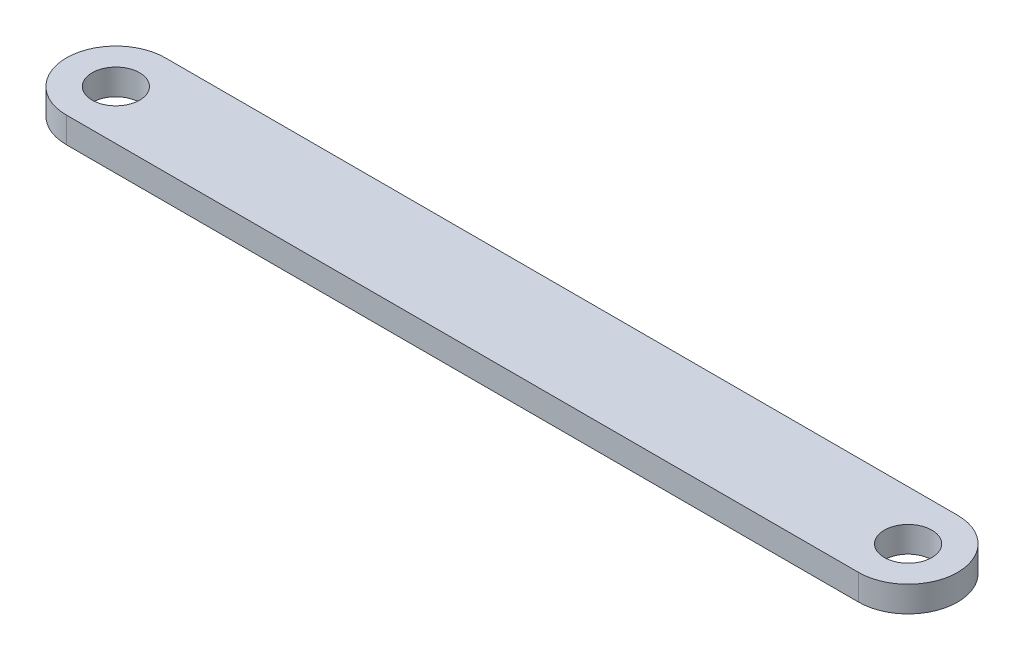
ISO-10303-21;
HEADER;
FILE_DESCRIPTION(('STEP AP214'),'2;1');
FILE_NAME('part.step','',(''),(''),'','','');
FILE_SCHEMA(('AUTOMOTIVE_DESIGN { 1 0 10303 214 1 1 1 1 }'));
ENDSEC;
DATA;
#1=APPLICATION_CONTEXT('core data for automotive mechanical design processes');
#2=APPLICATION_PROTOCOL_DEFINITION('international standard','automotive_design',2000,#1);
#3=PRODUCT_CONTEXT('',#1,'mechanical');
#4=PRODUCT('Part','Part','',(#3));
#5=PRODUCT_RELATED_PRODUCT_CATEGORY('part','',(#4));
#6=PRODUCT_DEFINITION_FORMATION('','',#4);
#7=PRODUCT_DEFINITION_CONTEXT('part definition',#1,'design');
#8=PRODUCT_DEFINITION('design','',#6,#7);
#9=PRODUCT_DEFINITION_SHAPE('','',#8);
#10=(LENGTH_UNIT() NAMED_UNIT(*) SI_UNIT(.MILLI.,.METRE.));
#11=(NAMED_UNIT(*) PLANE_ANGLE_UNIT() SI_UNIT($,.RADIAN.));
#12=(NAMED_UNIT(*) SI_UNIT($,.STERADIAN.) SOLID_ANGLE_UNIT());
#13=UNCERTAINTY_MEASURE_WITH_UNIT(LENGTH_MEASURE(1.E-05),#10,'distance_accuracy_value','');
#14=(GEOMETRIC_REPRESENTATION_CONTEXT(3) GLOBAL_UNCERTAINTY_ASSIGNED_CONTEXT((#13)) GLOBAL_UNIT_ASSIGNED_CONTEXT((#10,
#11,#12)) REPRESENTATION_CONTEXT('',''));
#15=CARTESIAN_POINT('',(0.,0.,0.));
#16=DIRECTION('',(0.,0.,1.));
#17=DIRECTION('',(1.,0.,0.));
#18=AXIS2_PLACEMENT_3D('',#15,#16,#17);
#19=CARTESIAN_POINT('',(0.,6.5,0.));
#20=DIRECTION('',(0.,1.,0.));
#21=DIRECTION('',(0.,0.,1.));
#22=AXIS2_PLACEMENT_3D('',#19,#20,#21);
#23=PLANE('',#22);
#24=CARTESIAN_POINT('',(0.,6.5,0.));
#25=DIRECTION('',(0.,1.,0.));
#26=DIRECTION('',(0.,0.,1.));
#27=AXIS2_PLACEMENT_3D('',#24,#25,#26);
#28=CIRCLE('',#27,6.);
#29=CARTESIAN_POINT('',(0.,6.5,-6.));
#30=VERTEX_POINT('',#29);
#31=EDGE_CURVE('E112',#30,#30,#28,.T.);
#32=ORIENTED_EDGE('',*,*,#31,.F.);
#33=EDGE_LOOP('',(#32));
#34=FACE_BOUND('',#33,.T.);
#35=CARTESIAN_POINT('',(0.,6.5,0.));
#36=DIRECTION('',(0.,1.,0.));
#37=DIRECTION('',(0.,0.,1.));
#38=AXIS2_PLACEMENT_3D('',#35,#36,#37);
#39=CIRCLE('',#38,12.5);
#40=CARTESIAN_POINT('',(0.,6.5,-12.5));
#41=VERTEX_POINT('',#40);
#42=CARTESIAN_POINT('',(0.,6.5,12.5));
#43=VERTEX_POINT('',#42);
#44=EDGE_CURVE('E92',#41,#43,#39,.T.);
#45=ORIENTED_EDGE('',*,*,#44,.T.);
#46=DIRECTION('',(1.,0.,0.));
#47=VECTOR('',#46,1.);
#48=CARTESIAN_POINT('',(0.,6.5,12.5));
#49=LINE('',#48,#47);
#50=CARTESIAN_POINT('',(200.,6.5,12.5));
#51=VERTEX_POINT('',#50);
#52=EDGE_CURVE('E87',#43,#51,#49,.T.);
#53=ORIENTED_EDGE('',*,*,#52,.T.);
#54=CARTESIAN_POINT('',(200.,6.5,0.));
#55=DIRECTION('',(0.,1.,0.));
#56=DIRECTION('',(0.,0.,1.));
#57=AXIS2_PLACEMENT_3D('',#54,#55,#56);
#58=CIRCLE('',#57,12.5);
#59=CARTESIAN_POINT('',(200.,6.5,-12.5));
#60=VERTEX_POINT('',#59);
#61=EDGE_CURVE('E90',#51,#60,#58,.T.);
#62=ORIENTED_EDGE('',*,*,#61,.T.);
#63=DIRECTION('',(-1.,0.,0.));
#64=VECTOR('',#63,1.);
#65=CARTESIAN_POINT('',(0.,6.5,-12.5));
#66=LINE('',#65,#64);
#67=EDGE_CURVE('E57',#60,#41,#66,.T.);
#68=ORIENTED_EDGE('',*,*,#67,.T.);
#69=EDGE_LOOP('',(#45,#53,#62,#68));
#70=FACE_BOUND('',#69,.T.);
#71=CARTESIAN_POINT('',(200.,6.5,0.));
#72=DIRECTION('',(0.,1.,0.));
#73=DIRECTION('',(0.,0.,1.));
#74=AXIS2_PLACEMENT_3D('',#71,#72,#73);
#75=CIRCLE('',#74,6.00000000000002);
#76=CARTESIAN_POINT('',(200.,6.5,-6.00000000000002));
#77=VERTEX_POINT('',#76);
#78=EDGE_CURVE('E134',#77,#77,#75,.T.);
#79=ORIENTED_EDGE('',*,*,#78,.F.);
#80=EDGE_LOOP('',(#79));
#81=FACE_BOUND('',#80,.T.);
#82=ADVANCED_FACE('F39',(#34,#70,#81),#23,.T.);
#83=CARTESIAN_POINT('',(0.,0.,0.));
#84=DIRECTION('',(0.,1.,0.));
#85=DIRECTION('',(0.,0.,1.));
#86=AXIS2_PLACEMENT_3D('',#83,#84,#85);
#87=PLANE('',#86);
#88=CARTESIAN_POINT('',(0.,0.,0.));
#89=DIRECTION('',(0.,1.,0.));
#90=DIRECTION('',(0.,0.,1.));
#91=AXIS2_PLACEMENT_3D('',#88,#89,#90);
#92=CIRCLE('',#91,12.5);
#93=CARTESIAN_POINT('',(0.,0.,-12.5));
#94=VERTEX_POINT('',#93);
#95=CARTESIAN_POINT('',(0.,0.,12.5));
#96=VERTEX_POINT('',#95);
#97=EDGE_CURVE('E108',#94,#96,#92,.T.);
#98=ORIENTED_EDGE('',*,*,#97,.F.);
#99=DIRECTION('',(-1.,0.,0.));
#100=VECTOR('',#99,1.);
#101=CARTESIAN_POINT('',(0.,0.,-12.5));
#102=LINE('',#101,#100);
#103=CARTESIAN_POINT('',(200.,0.,-12.5));
#104=VERTEX_POINT('',#103);
#105=EDGE_CURVE('E80',#104,#94,#102,.T.);
#106=ORIENTED_EDGE('',*,*,#105,.F.);
#107=CARTESIAN_POINT('',(200.,0.,0.));
#108=DIRECTION('',(0.,1.,0.));
#109=DIRECTION('',(0.,0.,1.));
#110=AXIS2_PLACEMENT_3D('',#107,#108,#109);
#111=CIRCLE('',#110,12.5);
#112=CARTESIAN_POINT('',(200.,0.,12.5));
#113=VERTEX_POINT('',#112);
#114=EDGE_CURVE('E74',#113,#104,#111,.T.);
#115=ORIENTED_EDGE('',*,*,#114,.F.);
#116=DIRECTION('',(1.,0.,0.));
#117=VECTOR('',#116,1.);
#118=CARTESIAN_POINT('',(0.,0.,12.5));
#119=LINE('',#118,#117);
#120=EDGE_CURVE('E97',#96,#113,#119,.T.);
#121=ORIENTED_EDGE('',*,*,#120,.F.);
#122=EDGE_LOOP('',(#98,#106,#115,#121));
#123=FACE_BOUND('',#122,.T.);
#124=CARTESIAN_POINT('',(0.,0.,0.));
#125=DIRECTION('',(0.,1.,0.));
#126=DIRECTION('',(0.,0.,1.));
#127=AXIS2_PLACEMENT_3D('',#124,#125,#126);
#128=CIRCLE('',#127,6.);
#129=CARTESIAN_POINT('',(0.,0.,-6.));
#130=VERTEX_POINT('',#129);
#131=EDGE_CURVE('E130',#130,#130,#128,.T.);
#132=ORIENTED_EDGE('',*,*,#131,.T.);
#133=EDGE_LOOP('',(#132));
#134=FACE_BOUND('',#133,.T.);
#135=CARTESIAN_POINT('',(200.,0.,0.));
#136=DIRECTION('',(0.,1.,0.));
#137=DIRECTION('',(0.,0.,1.));
#138=AXIS2_PLACEMENT_3D('',#135,#136,#137);
#139=CIRCLE('',#138,6.00000000000002);
#140=CARTESIAN_POINT('',(200.,0.,-6.00000000000002));
#141=VERTEX_POINT('',#140);
#142=EDGE_CURVE('E138',#141,#141,#139,.T.);
#143=ORIENTED_EDGE('',*,*,#142,.T.);
#144=EDGE_LOOP('',(#143));
#145=FACE_BOUND('',#144,.T.);
#146=ADVANCED_FACE('F125',(#123,#134,#145),#87,.F.);
#147=CARTESIAN_POINT('',(0.,6.5,0.));
#148=DIRECTION('',(0.,-1.,0.));
#149=DIRECTION('',(0.,0.,-1.));
#150=AXIS2_PLACEMENT_3D('',#147,#148,#149);
#151=CYLINDRICAL_SURFACE('',#150,12.5);
#152=ORIENTED_EDGE('',*,*,#97,.T.);
#153=DIRECTION('',(0.,-1.,0.));
#154=VECTOR('',#153,1.);
#155=CARTESIAN_POINT('',(0.,6.5,12.5));
#156=LINE('',#155,#154);
#157=EDGE_CURVE('E11',#43,#96,#156,.T.);
#158=ORIENTED_EDGE('',*,*,#157,.F.);
#159=ORIENTED_EDGE('',*,*,#44,.F.);
#160=DIRECTION('',(0.,-1.,0.));
#161=VECTOR('',#160,1.);
#162=CARTESIAN_POINT('',(0.,6.5,-12.5));
#163=LINE('',#162,#161);
#164=EDGE_CURVE('E104',#41,#94,#163,.T.);
#165=ORIENTED_EDGE('',*,*,#164,.T.);
#166=EDGE_LOOP('',(#152,#158,#159,#165));
#167=FACE_BOUND('',#166,.T.);
#168=ADVANCED_FACE('F41',(#167),#151,.T.);
#169=CARTESIAN_POINT('',(0.,6.5,12.5));
#170=DIRECTION('',(0.,0.,-1.));
#171=DIRECTION('',(-1.,0.,0.));
#172=AXIS2_PLACEMENT_3D('',#169,#170,#171);
#173=PLANE('',#172);
#174=ORIENTED_EDGE('',*,*,#120,.T.);
#175=DIRECTION('',(0.,-1.,0.));
#176=VECTOR('',#175,1.);
#177=CARTESIAN_POINT('',(200.,6.5,12.5));
#178=LINE('',#177,#176);
#179=EDGE_CURVE('E49',#51,#113,#178,.T.);
#180=ORIENTED_EDGE('',*,*,#179,.F.);
#181=ORIENTED_EDGE('',*,*,#52,.F.);
#182=ORIENTED_EDGE('',*,*,#157,.T.);
#183=EDGE_LOOP('',(#174,#180,#181,#182));
#184=FACE_BOUND('',#183,.T.);
#185=ADVANCED_FACE('F96',(#184),#173,.F.);
#186=CARTESIAN_POINT('',(200.,6.5,0.));
#187=DIRECTION('',(0.,-1.,0.));
#188=DIRECTION('',(0.,0.,-1.));
#189=AXIS2_PLACEMENT_3D('',#186,#187,#188);
#190=CYLINDRICAL_SURFACE('',#189,12.5);
#191=ORIENTED_EDGE('',*,*,#114,.T.);
#192=DIRECTION('',(0.,-1.,0.));
#193=VECTOR('',#192,1.);
#194=CARTESIAN_POINT('',(200.,6.5,-12.5));
#195=LINE('',#194,#193);
#196=EDGE_CURVE('E99',#60,#104,#195,.T.);
#197=ORIENTED_EDGE('',*,*,#196,.F.);
#198=ORIENTED_EDGE('',*,*,#61,.F.);
#199=ORIENTED_EDGE('',*,*,#179,.T.);
#200=EDGE_LOOP('',(#191,#197,#198,#199));
#201=FACE_BOUND('',#200,.T.);
#202=ADVANCED_FACE('F100',(#201),#190,.T.);
#203=CARTESIAN_POINT('',(0.,6.5,-12.5));
#204=DIRECTION('',(0.,0.,1.));
#205=DIRECTION('',(1.,0.,0.));
#206=AXIS2_PLACEMENT_3D('',#203,#204,#205);
#207=PLANE('',#206);
#208=ORIENTED_EDGE('',*,*,#105,.T.);
#209=ORIENTED_EDGE('',*,*,#164,.F.);
#210=ORIENTED_EDGE('',*,*,#67,.F.);
#211=ORIENTED_EDGE('',*,*,#196,.T.);
#212=EDGE_LOOP('',(#208,#209,#210,#211));
#213=FACE_BOUND('',#212,.T.);
#214=ADVANCED_FACE('F122',(#213),#207,.F.);
#215=CARTESIAN_POINT('',(0.,6.5,0.));
#216=DIRECTION('',(0.,-1.,0.));
#217=DIRECTION('',(0.,0.,-1.));
#218=AXIS2_PLACEMENT_3D('',#215,#216,#217);
#219=CYLINDRICAL_SURFACE('',#218,6.);
#220=CARTESIAN_POINT('',(0.,6.5,-6.));
#221=CARTESIAN_POINT('',(0.,6.43229166666667,-6.));
#222=CARTESIAN_POINT('',(0.,6.36458333333333,-6.));
#223=CARTESIAN_POINT('',(0.,6.22916666666667,-6.));
#224=CARTESIAN_POINT('',(0.,6.16145833333333,-6.));
#225=CARTESIAN_POINT('',(0.,6.02604166666667,-6.));
#226=CARTESIAN_POINT('',(0.,5.95833333333333,-6.));
#227=CARTESIAN_POINT('',(0.,5.82291666666667,-6.));
#228=CARTESIAN_POINT('',(0.,5.75520833333333,-6.));
#229=CARTESIAN_POINT('',(0.,5.61979166666667,-6.));
#230=CARTESIAN_POINT('',(0.,5.55208333333333,-6.));
#231=CARTESIAN_POINT('',(0.,5.41666666666667,-6.));
#232=CARTESIAN_POINT('',(0.,5.34895833333333,-6.));
#233=CARTESIAN_POINT('',(0.,5.21354166666667,-6.));
#234=CARTESIAN_POINT('',(0.,5.14583333333333,-6.));
#235=CARTESIAN_POINT('',(0.,5.01041666666667,-6.));
#236=CARTESIAN_POINT('',(0.,4.94270833333333,-6.));
#237=CARTESIAN_POINT('',(0.,4.80729166666667,-6.));
#238=CARTESIAN_POINT('',(0.,4.73958333333333,-6.));
#239=CARTESIAN_POINT('',(0.,4.60416666666667,-6.));
#240=CARTESIAN_POINT('',(0.,4.53645833333333,-6.));
#241=CARTESIAN_POINT('',(0.,4.40104166666667,-6.));
#242=CARTESIAN_POINT('',(0.,4.33333333333333,-6.));
#243=CARTESIAN_POINT('',(0.,4.19791666666667,-6.));
#244=CARTESIAN_POINT('',(0.,4.13020833333333,-6.));
#245=CARTESIAN_POINT('',(0.,3.99479166666667,-6.));
#246=CARTESIAN_POINT('',(0.,3.92708333333333,-6.));
#247=CARTESIAN_POINT('',(0.,3.79166666666667,-6.));
#248=CARTESIAN_POINT('',(0.,3.72395833333333,-6.));
#249=CARTESIAN_POINT('',(0.,3.58854166666667,-6.));
#250=CARTESIAN_POINT('',(0.,3.52083333333333,-6.));
#251=CARTESIAN_POINT('',(0.,3.38541666666667,-6.));
#252=CARTESIAN_POINT('',(0.,3.31770833333333,-6.));
#253=CARTESIAN_POINT('',(0.,3.18229166666667,-6.));
#254=CARTESIAN_POINT('',(0.,3.11458333333333,-6.));
#255=CARTESIAN_POINT('',(0.,2.97916666666667,-6.));
#256=CARTESIAN_POINT('',(0.,2.91145833333333,-6.));
#257=CARTESIAN_POINT('',(0.,2.77604166666667,-6.));
#258=CARTESIAN_POINT('',(0.,2.70833333333333,-6.));
#259=CARTESIAN_POINT('',(0.,2.57291666666667,-6.));
#260=CARTESIAN_POINT('',(0.,2.50520833333333,-6.));
#261=CARTESIAN_POINT('',(0.,2.36979166666667,-6.));
#262=CARTESIAN_POINT('',(0.,2.30208333333333,-6.));
#263=CARTESIAN_POINT('',(0.,2.16666666666667,-6.));
#264=CARTESIAN_POINT('',(0.,2.09895833333333,-6.));
#265=CARTESIAN_POINT('',(0.,1.96354166666667,-6.));
#266=CARTESIAN_POINT('',(0.,1.89583333333333,-6.));
#267=CARTESIAN_POINT('',(0.,1.76041666666667,-6.));
#268=CARTESIAN_POINT('',(0.,1.69270833333333,-6.));
#269=CARTESIAN_POINT('',(0.,1.55729166666667,-6.));
#270=CARTESIAN_POINT('',(0.,1.48958333333333,-6.));
#271=CARTESIAN_POINT('',(0.,1.35416666666667,-6.));
#272=CARTESIAN_POINT('',(0.,1.28645833333333,-6.));
#273=CARTESIAN_POINT('',(0.,1.15104166666667,-6.));
#274=CARTESIAN_POINT('',(0.,1.08333333333333,-6.));
#275=CARTESIAN_POINT('',(0.,0.947916666666667,-6.));
#276=CARTESIAN_POINT('',(0.,0.880208333333333,-6.));
#277=CARTESIAN_POINT('',(0.,0.744791666666667,-6.));
#278=CARTESIAN_POINT('',(0.,0.677083333333333,-6.));
#279=CARTESIAN_POINT('',(0.,0.541666666666667,-6.));
#280=CARTESIAN_POINT('',(0.,0.473958333333333,-6.));
#281=CARTESIAN_POINT('',(0.,0.338541666666667,-6.));
#282=CARTESIAN_POINT('',(0.,0.270833333333334,-6.));
#283=CARTESIAN_POINT('',(0.,0.135416666666667,-6.));
#284=CARTESIAN_POINT('',(0.,0.0677083333333334,-6.));
#285=CARTESIAN_POINT('',(0.,0.,-6.));
#286=B_SPLINE_CURVE_WITH_KNOTS('',3,(#220,#221,#222,#223,#224,#225,#226,#227,#228,#229,#230,
#231,#232,#233,#234,#235,#236,#237,#238,#239,#240,#241,#242,#243,#244,#245,#246,#247,#248,#249,
#250,#251,#252,#253,#254,#255,#256,#257,#258,#259,#260,#261,#262,#263,#264,#265,#266,#267,#268,
#269,#270,#271,#272,#273,#274,#275,#276,#277,#278,#279,#280,#281,#282,#283,#284,#285),
.UNSPECIFIED.,.F.,.F.,(4,2,2,2,2,2,2,2,2,2,2,2,2,2,2,2,2,2,2,2,2,2,2,2,2,2,2,2,2,2,2,2,4),(0.,
0.203125,0.40625,0.609375000000001,0.812500000000001,1.015625,1.21875,1.421875,1.625,1.828125,
2.03125,2.234375,2.4375,2.640625,2.84375,3.046875,3.25,3.453125,3.65625,3.859375,4.0625,
4.265625,4.46875,4.671875,4.875,5.078125,5.28125,5.484375,5.6875,5.890625,6.09375,6.296875,6.5),.UNSPECIFIED.);
#287=EDGE_CURVE('BSEAM157',#30,#130,#286,.T.);
#288=ORIENTED_EDGE('',*,*,#31,.T.);
#289=ORIENTED_EDGE('',*,*,#131,.F.);
#290=ORIENTED_EDGE('',*,*,#287,.T.);
#291=ORIENTED_EDGE('',*,*,#287,.F.);
#292=EDGE_LOOP('',(#288,#290,#289,#291));
#293=FACE_BOUND('',#292,.T.);
#294=ADVANCED_FACE('F157',(#293),#219,.F.);
#295=CARTESIAN_POINT('',(200.,6.5,0.));
#296=DIRECTION('',(0.,-1.,0.));
#297=DIRECTION('',(0.,0.,-1.));
#298=AXIS2_PLACEMENT_3D('',#295,#296,#297);
#299=CYLINDRICAL_SURFACE('',#298,6.00000000000002);
#300=CARTESIAN_POINT('',(200.,6.5,-6.00000000000002));
#301=CARTESIAN_POINT('',(200.,6.43229166666667,-6.00000000000002));
#302=CARTESIAN_POINT('',(200.,6.36458333333333,-6.00000000000002));
#303=CARTESIAN_POINT('',(200.,6.22916666666667,-6.00000000000002));
#304=CARTESIAN_POINT('',(200.,6.16145833333333,-6.00000000000002));
#305=CARTESIAN_POINT('',(200.,6.02604166666667,-6.00000000000002));
#306=CARTESIAN_POINT('',(200.,5.95833333333333,-6.00000000000002));
#307=CARTESIAN_POINT('',(200.,5.82291666666667,-6.00000000000002));
#308=CARTESIAN_POINT('',(200.,5.75520833333333,-6.00000000000002));
#309=CARTESIAN_POINT('',(200.,5.61979166666667,-6.00000000000002));
#310=CARTESIAN_POINT('',(200.,5.55208333333333,-6.00000000000002));
#311=CARTESIAN_POINT('',(200.,5.41666666666667,-6.00000000000002));
#312=CARTESIAN_POINT('',(200.,5.34895833333333,-6.00000000000002));
#313=CARTESIAN_POINT('',(200.,5.21354166666667,-6.00000000000002));
#314=CARTESIAN_POINT('',(200.,5.14583333333333,-6.00000000000002));
#315=CARTESIAN_POINT('',(200.,5.01041666666667,-6.00000000000002));
#316=CARTESIAN_POINT('',(200.,4.94270833333333,-6.00000000000002));
#317=CARTESIAN_POINT('',(200.,4.80729166666667,-6.00000000000002));
#318=CARTESIAN_POINT('',(200.,4.73958333333333,-6.00000000000002));
#319=CARTESIAN_POINT('',(200.,4.60416666666667,-6.00000000000002));
#320=CARTESIAN_POINT('',(200.,4.53645833333333,-6.00000000000002));
#321=CARTESIAN_POINT('',(200.,4.40104166666667,-6.00000000000002));
#322=CARTESIAN_POINT('',(200.,4.33333333333333,-6.00000000000002));
#323=CARTESIAN_POINT('',(200.,4.19791666666667,-6.00000000000002));
#324=CARTESIAN_POINT('',(200.,4.13020833333333,-6.00000000000002));
#325=CARTESIAN_POINT('',(200.,3.99479166666667,-6.00000000000002));
#326=CARTESIAN_POINT('',(200.,3.92708333333333,-6.00000000000002));
#327=CARTESIAN_POINT('',(200.,3.79166666666667,-6.00000000000002));
#328=CARTESIAN_POINT('',(200.,3.72395833333333,-6.00000000000002));
#329=CARTESIAN_POINT('',(200.,3.58854166666667,-6.00000000000002));
#330=CARTESIAN_POINT('',(200.,3.52083333333333,-6.00000000000002));
#331=CARTESIAN_POINT('',(200.,3.38541666666667,-6.00000000000002));
#332=CARTESIAN_POINT('',(200.,3.31770833333333,-6.00000000000002));
#333=CARTESIAN_POINT('',(200.,3.18229166666667,-6.00000000000002));
#334=CARTESIAN_POINT('',(200.,3.11458333333333,-6.00000000000002));
#335=CARTESIAN_POINT('',(200.,2.97916666666667,-6.00000000000002));
#336=CARTESIAN_POINT('',(200.,2.91145833333333,-6.00000000000002));
#337=CARTESIAN_POINT('',(200.,2.77604166666667,-6.00000000000002));
#338=CARTESIAN_POINT('',(200.,2.70833333333333,-6.00000000000002));
#339=CARTESIAN_POINT('',(200.,2.57291666666667,-6.00000000000002));
#340=CARTESIAN_POINT('',(200.,2.50520833333333,-6.00000000000002));
#341=CARTESIAN_POINT('',(200.,2.36979166666667,-6.00000000000002));
#342=CARTESIAN_POINT('',(200.,2.30208333333333,-6.00000000000002));
#343=CARTESIAN_POINT('',(200.,2.16666666666667,-6.00000000000002));
#344=CARTESIAN_POINT('',(200.,2.09895833333333,-6.00000000000002));
#345=CARTESIAN_POINT('',(200.,1.96354166666667,-6.00000000000002));
#346=CARTESIAN_POINT('',(200.,1.89583333333333,-6.00000000000002));
#347=CARTESIAN_POINT('',(200.,1.76041666666667,-6.00000000000002));
#348=CARTESIAN_POINT('',(200.,1.69270833333333,-6.00000000000002));
#349=CARTESIAN_POINT('',(200.,1.55729166666667,-6.00000000000002));
#350=CARTESIAN_POINT('',(200.,1.48958333333333,-6.00000000000002));
#351=CARTESIAN_POINT('',(200.,1.35416666666667,-6.00000000000002));
#352=CARTESIAN_POINT('',(200.,1.28645833333333,-6.00000000000002));
#353=CARTESIAN_POINT('',(200.,1.15104166666667,-6.00000000000002));
#354=CARTESIAN_POINT('',(200.,1.08333333333333,-6.00000000000002));
#355=CARTESIAN_POINT('',(200.,0.947916666666667,-6.00000000000002));
#356=CARTESIAN_POINT('',(200.,0.880208333333333,-6.00000000000002));
#357=CARTESIAN_POINT('',(200.,0.744791666666667,-6.00000000000002));
#358=CARTESIAN_POINT('',(200.,0.677083333333333,-6.00000000000002));
#359=CARTESIAN_POINT('',(200.,0.541666666666667,-6.00000000000002));
#360=CARTESIAN_POINT('',(200.,0.473958333333333,-6.00000000000002));
#361=CARTESIAN_POINT('',(200.,0.338541666666667,-6.00000000000002));
#362=CARTESIAN_POINT('',(200.,0.270833333333334,-6.00000000000002));
#363=CARTESIAN_POINT('',(200.,0.135416666666667,-6.00000000000002));
#364=CARTESIAN_POINT('',(200.,0.0677083333333334,-6.00000000000002));
#365=CARTESIAN_POINT('',(200.,0.,-6.00000000000002));
#366=B_SPLINE_CURVE_WITH_KNOTS('',3,(#300,#301,#302,#303,#304,#305,#306,#307,#308,#309,#310,
#311,#312,#313,#314,#315,#316,#317,#318,#319,#320,#321,#322,#323,#324,#325,#326,#327,#328,#329,
#330,#331,#332,#333,#334,#335,#336,#337,#338,#339,#340,#341,#342,#343,#344,#345,#346,#347,#348,
#349,#350,#351,#352,#353,#354,#355,#356,#357,#358,#359,#360,#361,#362,#363,#364,#365),
.UNSPECIFIED.,.F.,.F.,(4,2,2,2,2,2,2,2,2,2,2,2,2,2,2,2,2,2,2,2,2,2,2,2,2,2,2,2,2,2,2,2,4),(0.,
0.203125,0.40625,0.609375000000001,0.812500000000001,1.015625,1.21875,1.421875,1.625,1.828125,
2.03125,2.234375,2.4375,2.640625,2.84375,3.046875,3.25,3.453125,3.65625,3.859375,4.0625,
4.265625,4.46875,4.671875,4.875,5.078125,5.28125,5.484375,5.6875,5.890625,6.09375,6.296875,6.5),.UNSPECIFIED.);
#367=EDGE_CURVE('BSEAM146',#77,#141,#366,.T.);
#368=ORIENTED_EDGE('',*,*,#78,.T.);
#369=ORIENTED_EDGE('',*,*,#142,.F.);
#370=ORIENTED_EDGE('',*,*,#367,.T.);
#371=ORIENTED_EDGE('',*,*,#367,.F.);
#372=EDGE_LOOP('',(#368,#370,#369,#371));
#373=FACE_BOUND('',#372,.T.);
#374=ADVANCED_FACE('F146',(#373),#299,.F.);
#375=CLOSED_SHELL('',(#82,#146,#168,#185,#202,#214,#294,#374));
#376=MANIFOLD_SOLID_BREP('B2',#375);
#377=ADVANCED_BREP_SHAPE_REPRESENTATION('',(#18,#376),#14);
#378=SHAPE_DEFINITION_REPRESENTATION(#9,#377);
ENDSEC;
END-ISO-10303-21;
